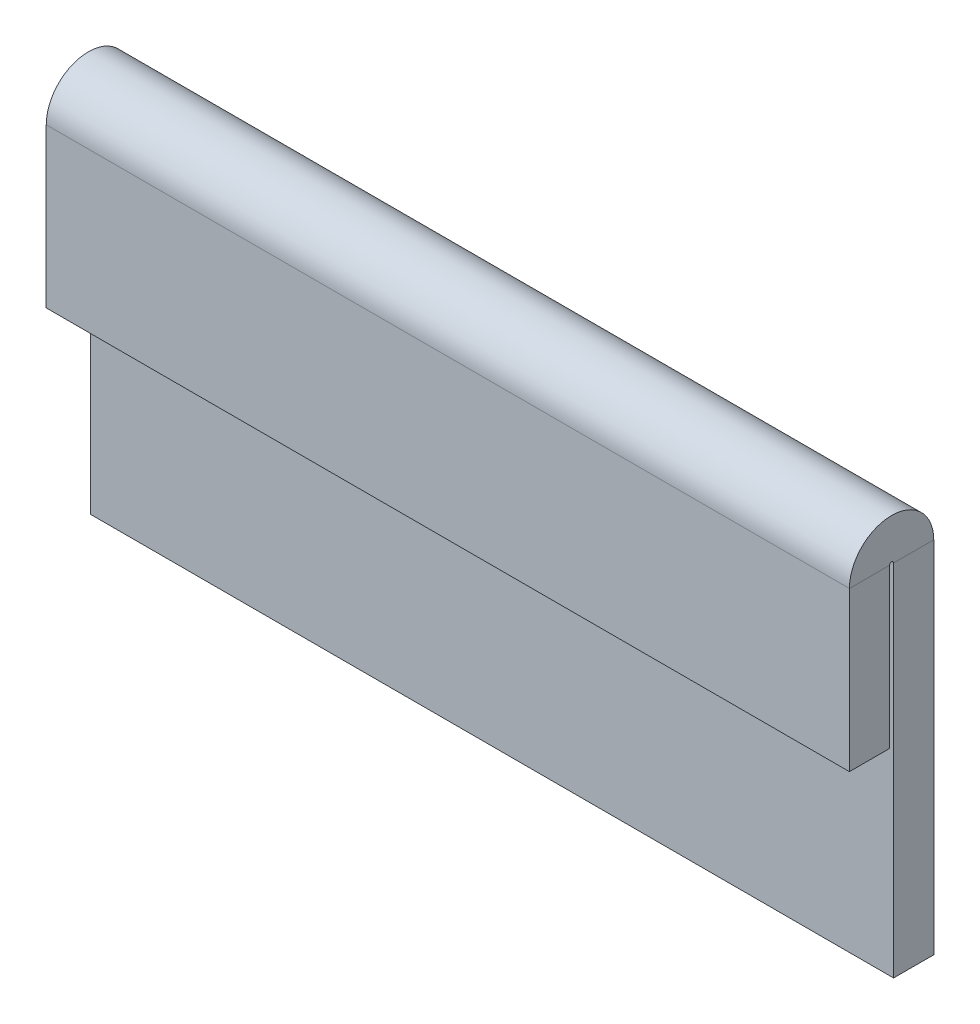
ISO-10303-21;
HEADER;
FILE_DESCRIPTION(('STEP AP214'),'2;1');
FILE_NAME('part.step','',(''),(''),'','','');
FILE_SCHEMA(('AUTOMOTIVE_DESIGN { 1 0 10303 214 1 1 1 1 }'));
ENDSEC;
DATA;
#1=APPLICATION_CONTEXT('core data for automotive mechanical design processes');
#2=APPLICATION_PROTOCOL_DEFINITION('international standard','automotive_design',2000,#1);
#3=PRODUCT_CONTEXT('',#1,'mechanical');
#4=PRODUCT('Part','Part','',(#3));
#5=PRODUCT_RELATED_PRODUCT_CATEGORY('part','',(#4));
#6=PRODUCT_DEFINITION_FORMATION('','',#4);
#7=PRODUCT_DEFINITION_CONTEXT('part definition',#1,'design');
#8=PRODUCT_DEFINITION('design','',#6,#7);
#9=PRODUCT_DEFINITION_SHAPE('','',#8);
#10=(LENGTH_UNIT() NAMED_UNIT(*) SI_UNIT(.MILLI.,.METRE.));
#11=(NAMED_UNIT(*) PLANE_ANGLE_UNIT() SI_UNIT($,.RADIAN.));
#12=(NAMED_UNIT(*) SI_UNIT($,.STERADIAN.) SOLID_ANGLE_UNIT());
#13=UNCERTAINTY_MEASURE_WITH_UNIT(LENGTH_MEASURE(1.E-05),#10,'distance_accuracy_value','');
#14=(GEOMETRIC_REPRESENTATION_CONTEXT(3) GLOBAL_UNCERTAINTY_ASSIGNED_CONTEXT((#13)) GLOBAL_UNIT_ASSIGNED_CONTEXT((#10,
#11,#12)) REPRESENTATION_CONTEXT('',''));
#15=CARTESIAN_POINT('',(0.,0.,0.));
#16=DIRECTION('',(0.,0.,1.));
#17=DIRECTION('',(1.,0.,0.));
#18=AXIS2_PLACEMENT_3D('',#15,#16,#17);
#19=CARTESIAN_POINT('',(0.,0.,-1.));
#20=DIRECTION('',(-1.,0.,0.));
#21=DIRECTION('',(0.,0.,1.));
#22=AXIS2_PLACEMENT_3D('',#19,#20,#21);
#23=PLANE('',#22);
#24=DIRECTION('',(0.,-1.,0.));
#25=VECTOR('',#24,1.);
#26=CARTESIAN_POINT('',(0.,0.,0.));
#27=LINE('',#26,#25);
#28=CARTESIAN_POINT('',(0.,8.95,0.));
#29=VERTEX_POINT('',#28);
#30=CARTESIAN_POINT('',(0.,0.,0.));
#31=VERTEX_POINT('',#30);
#32=EDGE_CURVE('E98',#29,#31,#27,.T.);
#33=ORIENTED_EDGE('',*,*,#32,.F.);
#34=DIRECTION('',(0.,0.,-1.));
#35=VECTOR('',#34,1.);
#36=CARTESIAN_POINT('',(0.,8.95,0.));
#37=LINE('',#36,#35);
#38=CARTESIAN_POINT('',(0.,8.95,-1.));
#39=VERTEX_POINT('',#38);
#40=EDGE_CURVE('E141',#29,#39,#37,.T.);
#41=ORIENTED_EDGE('',*,*,#40,.T.);
#42=DIRECTION('',(0.,-1.,0.));
#43=VECTOR('',#42,1.);
#44=CARTESIAN_POINT('',(0.,0.,-1.));
#45=LINE('',#44,#43);
#46=CARTESIAN_POINT('',(0.,0.,-1.));
#47=VERTEX_POINT('',#46);
#48=EDGE_CURVE('E94',#39,#47,#45,.T.);
#49=ORIENTED_EDGE('',*,*,#48,.T.);
#50=DIRECTION('',(0.,0.,1.));
#51=VECTOR('',#50,1.);
#52=CARTESIAN_POINT('',(0.,0.,-1.));
#53=LINE('',#52,#51);
#54=EDGE_CURVE('E48',#47,#31,#53,.T.);
#55=ORIENTED_EDGE('',*,*,#54,.T.);
#56=EDGE_LOOP('',(#33,#41,#49,#55));
#57=FACE_BOUND('',#56,.T.);
#58=ADVANCED_FACE('F44',(#57),#23,.T.);
#59=CARTESIAN_POINT('',(20.,0.,-1.));
#60=DIRECTION('',(1.,0.,0.));
#61=DIRECTION('',(0.,0.,-1.));
#62=AXIS2_PLACEMENT_3D('',#59,#60,#61);
#63=PLANE('',#62);
#64=DIRECTION('',(0.,0.,-1.));
#65=VECTOR('',#64,1.);
#66=CARTESIAN_POINT('',(20.,8.95,0.));
#67=LINE('',#66,#65);
#68=CARTESIAN_POINT('',(20.,8.95,0.));
#69=VERTEX_POINT('',#68);
#70=CARTESIAN_POINT('',(20.,8.95,-1.));
#71=VERTEX_POINT('',#70);
#72=EDGE_CURVE('E93',#69,#71,#67,.T.);
#73=ORIENTED_EDGE('',*,*,#72,.F.);
#74=DIRECTION('',(0.,1.,0.));
#75=VECTOR('',#74,1.);
#76=CARTESIAN_POINT('',(20.,0.,0.));
#77=LINE('',#76,#75);
#78=CARTESIAN_POINT('',(20.,0.,0.));
#79=VERTEX_POINT('',#78);
#80=EDGE_CURVE('E87',#79,#69,#77,.T.);
#81=ORIENTED_EDGE('',*,*,#80,.F.);
#82=DIRECTION('',(0.,0.,1.));
#83=VECTOR('',#82,1.);
#84=CARTESIAN_POINT('',(20.,0.,-1.));
#85=LINE('',#84,#83);
#86=CARTESIAN_POINT('',(20.,0.,-1.));
#87=VERTEX_POINT('',#86);
#88=EDGE_CURVE('E11',#87,#79,#85,.T.);
#89=ORIENTED_EDGE('',*,*,#88,.F.);
#90=DIRECTION('',(0.,1.,0.));
#91=VECTOR('',#90,1.);
#92=CARTESIAN_POINT('',(20.,0.,-1.));
#93=LINE('',#92,#91);
#94=EDGE_CURVE('E102',#87,#71,#93,.T.);
#95=ORIENTED_EDGE('',*,*,#94,.T.);
#96=EDGE_LOOP('',(#73,#81,#89,#95));
#97=FACE_BOUND('',#96,.T.);
#98=ADVANCED_FACE('F86',(#97),#63,.T.);
#99=CARTESIAN_POINT('',(0.,0.,-1.));
#100=DIRECTION('',(0.,-1.,0.));
#101=DIRECTION('',(0.,0.,-1.));
#102=AXIS2_PLACEMENT_3D('',#99,#100,#101);
#103=PLANE('',#102);
#104=DIRECTION('',(1.,0.,0.));
#105=VECTOR('',#104,1.);
#106=CARTESIAN_POINT('',(0.,0.,0.));
#107=LINE('',#106,#105);
#108=EDGE_CURVE('E82',#31,#79,#107,.T.);
#109=ORIENTED_EDGE('',*,*,#108,.F.);
#110=ORIENTED_EDGE('',*,*,#54,.F.);
#111=DIRECTION('',(1.,0.,0.));
#112=VECTOR('',#111,1.);
#113=CARTESIAN_POINT('',(0.,0.,-1.));
#114=LINE('',#113,#112);
#115=EDGE_CURVE('E83',#47,#87,#114,.T.);
#116=ORIENTED_EDGE('',*,*,#115,.T.);
#117=ORIENTED_EDGE('',*,*,#88,.T.);
#118=EDGE_LOOP('',(#109,#110,#116,#117));
#119=FACE_BOUND('',#118,.T.);
#120=ADVANCED_FACE('F80',(#119),#103,.T.);
#121=CARTESIAN_POINT('',(0.,0.,-1.));
#122=DIRECTION('',(0.,0.,-1.));
#123=DIRECTION('',(-1.,0.,0.));
#124=AXIS2_PLACEMENT_3D('',#121,#122,#123);
#125=PLANE('',#124);
#126=DIRECTION('',(-1.,0.,0.));
#127=VECTOR('',#126,1.);
#128=CARTESIAN_POINT('',(0.,8.95,-1.));
#129=LINE('',#128,#127);
#130=EDGE_CURVE('E160',#39,#71,#129,.F.);
#131=ORIENTED_EDGE('',*,*,#130,.T.);
#132=ORIENTED_EDGE('',*,*,#94,.F.);
#133=ORIENTED_EDGE('',*,*,#115,.F.);
#134=ORIENTED_EDGE('',*,*,#48,.F.);
#135=EDGE_LOOP('',(#131,#132,#133,#134));
#136=FACE_BOUND('',#135,.T.);
#137=ADVANCED_FACE('F164',(#136),#125,.T.);
#138=CARTESIAN_POINT('',(0.,0.,0.));
#139=DIRECTION('',(0.,0.,-1.));
#140=DIRECTION('',(-1.,0.,0.));
#141=AXIS2_PLACEMENT_3D('',#138,#139,#140);
#142=PLANE('',#141);
#143=ORIENTED_EDGE('',*,*,#80,.T.);
#144=DIRECTION('',(-1.,0.,0.));
#145=VECTOR('',#144,1.);
#146=CARTESIAN_POINT('',(0.,8.95,0.));
#147=LINE('',#146,#145);
#148=EDGE_CURVE('E149',#29,#69,#147,.F.);
#149=ORIENTED_EDGE('',*,*,#148,.F.);
#150=ORIENTED_EDGE('',*,*,#32,.T.);
#151=ORIENTED_EDGE('',*,*,#108,.T.);
#152=EDGE_LOOP('',(#143,#149,#150,#151));
#153=FACE_BOUND('',#152,.T.);
#154=ADVANCED_FACE('F96',(#153),#142,.F.);
#155=CARTESIAN_POINT('',(0.,6.975,1.1));
#156=DIRECTION('',(1.,0.,0.));
#157=DIRECTION('',(0.,1.,0.));
#158=AXIS2_PLACEMENT_3D('',#155,#156,#157);
#159=PLANE('',#158);
#160=DIRECTION('',(0.,0.,1.));
#161=VECTOR('',#160,1.);
#162=CARTESIAN_POINT('',(0.,8.95,1.1));
#163=LINE('',#162,#161);
#164=CARTESIAN_POINT('',(0.,8.95,0.1));
#165=VERTEX_POINT('',#164);
#166=CARTESIAN_POINT('',(0.,8.95,1.1));
#167=VERTEX_POINT('',#166);
#168=EDGE_CURVE('E113',#165,#167,#163,.T.);
#169=ORIENTED_EDGE('',*,*,#168,.F.);
#170=DIRECTION('',(0.,1.,0.));
#171=VECTOR('',#170,1.);
#172=CARTESIAN_POINT('',(0.,6.975,0.1));
#173=LINE('',#172,#171);
#174=CARTESIAN_POINT('',(0.,5.,0.1));
#175=VERTEX_POINT('',#174);
#176=EDGE_CURVE('E127',#175,#165,#173,.T.);
#177=ORIENTED_EDGE('',*,*,#176,.F.);
#178=DIRECTION('',(0.,0.,1.));
#179=VECTOR('',#178,1.);
#180=CARTESIAN_POINT('',(0.,5.,1.1));
#181=LINE('',#180,#179);
#182=CARTESIAN_POINT('',(0.,5.,1.1));
#183=VERTEX_POINT('',#182);
#184=EDGE_CURVE('E112',#175,#183,#181,.T.);
#185=ORIENTED_EDGE('',*,*,#184,.T.);
#186=DIRECTION('',(0.,1.,0.));
#187=VECTOR('',#186,1.);
#188=CARTESIAN_POINT('',(0.,6.975,1.1));
#189=LINE('',#188,#187);
#190=EDGE_CURVE('E139',#183,#167,#189,.T.);
#191=ORIENTED_EDGE('',*,*,#190,.T.);
#192=EDGE_LOOP('',(#169,#177,#185,#191));
#193=FACE_BOUND('',#192,.T.);
#194=ADVANCED_FACE('F191',(#193),#159,.F.);
#195=CARTESIAN_POINT('',(10.,5.,1.1));
#196=DIRECTION('',(0.,1.,0.));
#197=DIRECTION('',(-1.,0.,0.));
#198=AXIS2_PLACEMENT_3D('',#195,#196,#197);
#199=PLANE('',#198);
#200=ORIENTED_EDGE('',*,*,#184,.F.);
#201=DIRECTION('',(1.,0.,0.));
#202=VECTOR('',#201,1.);
#203=CARTESIAN_POINT('',(10.,5.,0.1));
#204=LINE('',#203,#202);
#205=CARTESIAN_POINT('',(20.,5.,0.1));
#206=VERTEX_POINT('',#205);
#207=EDGE_CURVE('E129',#206,#175,#204,.F.);
#208=ORIENTED_EDGE('',*,*,#207,.F.);
#209=DIRECTION('',(0.,0.,1.));
#210=VECTOR('',#209,1.);
#211=CARTESIAN_POINT('',(20.,5.,1.1));
#212=LINE('',#211,#210);
#213=CARTESIAN_POINT('',(20.,5.,1.1));
#214=VERTEX_POINT('',#213);
#215=EDGE_CURVE('E107',#206,#214,#212,.T.);
#216=ORIENTED_EDGE('',*,*,#215,.T.);
#217=DIRECTION('',(-1.,0.,0.));
#218=VECTOR('',#217,1.);
#219=CARTESIAN_POINT('',(10.,5.,1.1));
#220=LINE('',#219,#218);
#221=EDGE_CURVE('E115',#214,#183,#220,.T.);
#222=ORIENTED_EDGE('',*,*,#221,.T.);
#223=EDGE_LOOP('',(#200,#208,#216,#222));
#224=FACE_BOUND('',#223,.T.);
#225=ADVANCED_FACE('F197',(#224),#199,.F.);
#226=CARTESIAN_POINT('',(20.,6.975,1.1));
#227=DIRECTION('',(-1.,0.,0.));
#228=DIRECTION('',(0.,-1.,0.));
#229=AXIS2_PLACEMENT_3D('',#226,#227,#228);
#230=PLANE('',#229);
#231=DIRECTION('',(0.,1.,0.));
#232=VECTOR('',#231,1.);
#233=CARTESIAN_POINT('',(20.,6.975,0.1));
#234=LINE('',#233,#232);
#235=CARTESIAN_POINT('',(20.,8.95,0.1));
#236=VERTEX_POINT('',#235);
#237=EDGE_CURVE('E116',#236,#206,#234,.F.);
#238=ORIENTED_EDGE('',*,*,#237,.F.);
#239=DIRECTION('',(0.,0.,1.));
#240=VECTOR('',#239,1.);
#241=CARTESIAN_POINT('',(20.,8.95,1.1));
#242=LINE('',#241,#240);
#243=CARTESIAN_POINT('',(20.,8.95,1.1));
#244=VERTEX_POINT('',#243);
#245=EDGE_CURVE('E101',#236,#244,#242,.T.);
#246=ORIENTED_EDGE('',*,*,#245,.T.);
#247=DIRECTION('',(0.,-1.,0.));
#248=VECTOR('',#247,1.);
#249=CARTESIAN_POINT('',(20.,6.975,1.1));
#250=LINE('',#249,#248);
#251=EDGE_CURVE('E134',#244,#214,#250,.T.);
#252=ORIENTED_EDGE('',*,*,#251,.T.);
#253=ORIENTED_EDGE('',*,*,#215,.F.);
#254=EDGE_LOOP('',(#238,#246,#252,#253));
#255=FACE_BOUND('',#254,.T.);
#256=ADVANCED_FACE('F194',(#255),#230,.F.);
#257=CARTESIAN_POINT('',(10.,6.975,1.1));
#258=DIRECTION('',(0.,0.,1.));
#259=DIRECTION('',(1.,0.,0.));
#260=AXIS2_PLACEMENT_3D('',#257,#258,#259);
#261=PLANE('',#260);
#262=ORIENTED_EDGE('',*,*,#221,.F.);
#263=ORIENTED_EDGE('',*,*,#251,.F.);
#264=DIRECTION('',(1.,0.,0.));
#265=VECTOR('',#264,1.);
#266=CARTESIAN_POINT('',(10.,8.95,1.1));
#267=LINE('',#266,#265);
#268=EDGE_CURVE('E131',#167,#244,#267,.T.);
#269=ORIENTED_EDGE('',*,*,#268,.F.);
#270=ORIENTED_EDGE('',*,*,#190,.F.);
#271=EDGE_LOOP('',(#262,#263,#269,#270));
#272=FACE_BOUND('',#271,.T.);
#273=ADVANCED_FACE('F198',(#272),#261,.T.);
#274=CARTESIAN_POINT('',(10.,6.975,0.1));
#275=DIRECTION('',(0.,0.,1.));
#276=DIRECTION('',(1.,0.,0.));
#277=AXIS2_PLACEMENT_3D('',#274,#275,#276);
#278=PLANE('',#277);
#279=ORIENTED_EDGE('',*,*,#207,.T.);
#280=ORIENTED_EDGE('',*,*,#176,.T.);
#281=DIRECTION('',(1.,0.,0.));
#282=VECTOR('',#281,1.);
#283=CARTESIAN_POINT('',(10.,8.95,0.1));
#284=LINE('',#283,#282);
#285=EDGE_CURVE('E124',#165,#236,#284,.T.);
#286=ORIENTED_EDGE('',*,*,#285,.T.);
#287=ORIENTED_EDGE('',*,*,#237,.T.);
#288=EDGE_LOOP('',(#279,#280,#286,#287));
#289=FACE_BOUND('',#288,.T.);
#290=ADVANCED_FACE('F202',(#289),#278,.F.);
#291=CARTESIAN_POINT('',(20.,8.95,0.05));
#292=DIRECTION('',(1.,0.,0.));
#293=DIRECTION('',(0.,0.,-1.));
#294=AXIS2_PLACEMENT_3D('',#291,#292,#293);
#295=PLANE('',#294);
#296=ORIENTED_EDGE('',*,*,#245,.F.);
#297=CARTESIAN_POINT('',(20.,8.95,0.05));
#298=DIRECTION('',(-1.,0.,0.));
#299=DIRECTION('',(0.,0.,1.));
#300=AXIS2_PLACEMENT_3D('',#297,#298,#299);
#301=CIRCLE('',#300,0.05);
#302=EDGE_CURVE('E151',#69,#236,#301,.F.);
#303=ORIENTED_EDGE('',*,*,#302,.F.);
#304=ORIENTED_EDGE('',*,*,#72,.T.);
#305=CARTESIAN_POINT('',(20.,8.95,0.05));
#306=DIRECTION('',(-1.,0.,0.));
#307=DIRECTION('',(0.,0.,1.));
#308=AXIS2_PLACEMENT_3D('',#305,#306,#307);
#309=CIRCLE('',#308,1.05);
#310=EDGE_CURVE('E148',#71,#244,#309,.F.);
#311=ORIENTED_EDGE('',*,*,#310,.T.);
#312=EDGE_LOOP('',(#296,#303,#304,#311));
#313=FACE_BOUND('',#312,.T.);
#314=ADVANCED_FACE('F208',(#313),#295,.T.);
#315=CARTESIAN_POINT('',(0.,8.95,0.05));
#316=DIRECTION('',(1.,0.,0.));
#317=DIRECTION('',(0.,0.,-1.));
#318=AXIS2_PLACEMENT_3D('',#315,#316,#317);
#319=PLANE('',#318);
#320=CARTESIAN_POINT('',(0.,8.95,0.05));
#321=DIRECTION('',(-1.,0.,0.));
#322=DIRECTION('',(0.,0.,1.));
#323=AXIS2_PLACEMENT_3D('',#320,#321,#322);
#324=CIRCLE('',#323,0.05);
#325=EDGE_CURVE('E56',#165,#29,#324,.T.);
#326=ORIENTED_EDGE('',*,*,#325,.F.);
#327=ORIENTED_EDGE('',*,*,#168,.T.);
#328=CARTESIAN_POINT('',(0.,8.95,0.05));
#329=DIRECTION('',(-1.,0.,0.));
#330=DIRECTION('',(0.,0.,1.));
#331=AXIS2_PLACEMENT_3D('',#328,#329,#330);
#332=CIRCLE('',#331,1.05);
#333=EDGE_CURVE('E152',#167,#39,#332,.T.);
#334=ORIENTED_EDGE('',*,*,#333,.T.);
#335=ORIENTED_EDGE('',*,*,#40,.F.);
#336=EDGE_LOOP('',(#326,#327,#334,#335));
#337=FACE_BOUND('',#336,.T.);
#338=ADVANCED_FACE('F176',(#337),#319,.F.);
#339=CARTESIAN_POINT('',(0.,8.95,0.05));
#340=DIRECTION('',(-1.,0.,0.));
#341=DIRECTION('',(0.,0.,1.));
#342=AXIS2_PLACEMENT_3D('',#339,#340,#341);
#343=CYLINDRICAL_SURFACE('',#342,1.05);
#344=ORIENTED_EDGE('',*,*,#130,.F.);
#345=ORIENTED_EDGE('',*,*,#333,.F.);
#346=ORIENTED_EDGE('',*,*,#268,.T.);
#347=ORIENTED_EDGE('',*,*,#310,.F.);
#348=EDGE_LOOP('',(#344,#345,#346,#347));
#349=FACE_BOUND('',#348,.T.);
#350=ADVANCED_FACE('F174',(#349),#343,.T.);
#351=CARTESIAN_POINT('',(0.,8.95,0.05));
#352=DIRECTION('',(-1.,0.,0.));
#353=DIRECTION('',(0.,0.,1.));
#354=AXIS2_PLACEMENT_3D('',#351,#352,#353);
#355=CYLINDRICAL_SURFACE('',#354,0.05);
#356=ORIENTED_EDGE('',*,*,#148,.T.);
#357=ORIENTED_EDGE('',*,*,#302,.T.);
#358=ORIENTED_EDGE('',*,*,#285,.F.);
#359=ORIENTED_EDGE('',*,*,#325,.T.);
#360=EDGE_LOOP('',(#356,#357,#358,#359));
#361=FACE_BOUND('',#360,.T.);
#362=ADVANCED_FACE('F217',(#361),#355,.F.);
#363=CLOSED_SHELL('',(#58,#98,#120,#137,#154,#194,#225,#256,#273,#290,#314,#338,#350,#362));
#364=MANIFOLD_SOLID_BREP('B2',#363);
#365=ADVANCED_BREP_SHAPE_REPRESENTATION('',(#18,#364),#14);
#366=SHAPE_DEFINITION_REPRESENTATION(#9,#365);
ENDSEC;
END-ISO-10303-21;
